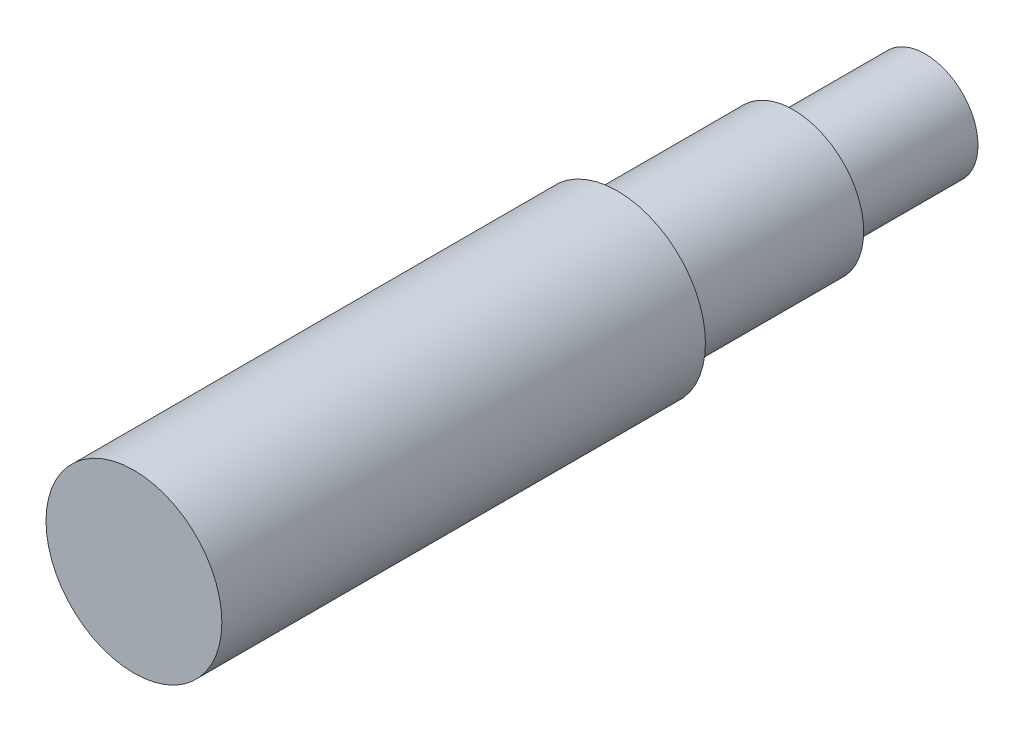
ISO-10303-21;
HEADER;
FILE_DESCRIPTION(('STEP AP214'),'2;1');
FILE_NAME('part.step','',(''),(''),'','','');
FILE_SCHEMA(('AUTOMOTIVE_DESIGN { 1 0 10303 214 1 1 1 1 }'));
ENDSEC;
DATA;
#1=APPLICATION_CONTEXT('core data for automotive mechanical design processes');
#2=APPLICATION_PROTOCOL_DEFINITION('international standard','automotive_design',2000,#1);
#3=PRODUCT_CONTEXT('',#1,'mechanical');
#4=PRODUCT('Part','Part','',(#3));
#5=PRODUCT_RELATED_PRODUCT_CATEGORY('part','',(#4));
#6=PRODUCT_DEFINITION_FORMATION('','',#4);
#7=PRODUCT_DEFINITION_CONTEXT('part definition',#1,'design');
#8=PRODUCT_DEFINITION('design','',#6,#7);
#9=PRODUCT_DEFINITION_SHAPE('','',#8);
#10=(LENGTH_UNIT() NAMED_UNIT(*) SI_UNIT(.MILLI.,.METRE.));
#11=(NAMED_UNIT(*) PLANE_ANGLE_UNIT() SI_UNIT($,.RADIAN.));
#12=(NAMED_UNIT(*) SI_UNIT($,.STERADIAN.) SOLID_ANGLE_UNIT());
#13=UNCERTAINTY_MEASURE_WITH_UNIT(LENGTH_MEASURE(1.E-05),#10,'distance_accuracy_value','');
#14=(GEOMETRIC_REPRESENTATION_CONTEXT(3) GLOBAL_UNCERTAINTY_ASSIGNED_CONTEXT((#13)) GLOBAL_UNIT_ASSIGNED_CONTEXT((#10,
#11,#12)) REPRESENTATION_CONTEXT('',''));
#15=CARTESIAN_POINT('',(0.,0.,0.));
#16=DIRECTION('',(0.,0.,1.));
#17=DIRECTION('',(1.,0.,0.));
#18=AXIS2_PLACEMENT_3D('',#15,#16,#17);
#19=CARTESIAN_POINT('',(0.,0.,0.));
#20=DIRECTION('',(0.,0.,-1.));
#21=DIRECTION('',(-1.,0.,0.));
#22=AXIS2_PLACEMENT_3D('',#19,#20,#21);
#23=PLANE('',#22);
#24=CARTESIAN_POINT('',(0.,0.,0.));
#25=DIRECTION('',(0.,0.,1.));
#26=DIRECTION('',(1.,0.,0.));
#27=AXIS2_PLACEMENT_3D('',#24,#25,#26);
#28=CIRCLE('',#27,20.);
#29=CARTESIAN_POINT('',(20.,0.,0.));
#30=VERTEX_POINT('',#29);
#31=EDGE_CURVE('E11',#30,#30,#28,.T.);
#32=ORIENTED_EDGE('',*,*,#31,.T.);
#33=EDGE_LOOP('',(#32));
#34=FACE_BOUND('',#33,.T.);
#35=ADVANCED_FACE('F40',(#34),#23,.F.);
#36=CARTESIAN_POINT('',(0.,0.,0.));
#37=DIRECTION('',(0.,0.,1.));
#38=DIRECTION('',(1.,0.,0.));
#39=AXIS2_PLACEMENT_3D('',#36,#37,#38);
#40=CYLINDRICAL_SURFACE('',#39,20.);
#41=ORIENTED_EDGE('',*,*,#31,.F.);
#42=EDGE_LOOP('',(#41));
#43=FACE_BOUND('',#42,.T.);
#44=CARTESIAN_POINT('',(0.,0.,-110.));
#45=DIRECTION('',(0.,0.,1.));
#46=DIRECTION('',(1.,0.,0.));
#47=AXIS2_PLACEMENT_3D('',#44,#45,#46);
#48=CIRCLE('',#47,20.);
#49=CARTESIAN_POINT('',(20.,0.,-110.));
#50=VERTEX_POINT('',#49);
#51=EDGE_CURVE('E48',#50,#50,#48,.T.);
#52=ORIENTED_EDGE('',*,*,#51,.T.);
#53=EDGE_LOOP('',(#52));
#54=FACE_BOUND('',#53,.T.);
#55=ADVANCED_FACE('F93',(#43,#54),#40,.T.);
#56=CARTESIAN_POINT('',(0.,20.,-110.));
#57=DIRECTION('',(0.,0.,1.));
#58=DIRECTION('',(1.,0.,0.));
#59=AXIS2_PLACEMENT_3D('',#56,#57,#58);
#60=PLANE('',#59);
#61=ORIENTED_EDGE('',*,*,#51,.F.);
#62=EDGE_LOOP('',(#61));
#63=FACE_BOUND('',#62,.T.);
#64=CARTESIAN_POINT('',(0.,0.,-110.));
#65=DIRECTION('',(0.,0.,1.));
#66=DIRECTION('',(1.,0.,0.));
#67=AXIS2_PLACEMENT_3D('',#64,#65,#66);
#68=CIRCLE('',#67,16.);
#69=CARTESIAN_POINT('',(16.,0.,-110.));
#70=VERTEX_POINT('',#69);
#71=EDGE_CURVE('E53',#70,#70,#68,.T.);
#72=ORIENTED_EDGE('',*,*,#71,.T.);
#73=EDGE_LOOP('',(#72));
#74=FACE_BOUND('',#73,.T.);
#75=ADVANCED_FACE('F97',(#63,#74),#60,.F.);
#76=CARTESIAN_POINT('',(0.,0.,0.));
#77=DIRECTION('',(0.,0.,1.));
#78=DIRECTION('',(1.,0.,0.));
#79=AXIS2_PLACEMENT_3D('',#76,#77,#78);
#80=CYLINDRICAL_SURFACE('',#79,16.);
#81=ORIENTED_EDGE('',*,*,#71,.F.);
#82=EDGE_LOOP('',(#81));
#83=FACE_BOUND('',#82,.T.);
#84=CARTESIAN_POINT('',(0.,0.,-150.));
#85=DIRECTION('',(0.,0.,1.));
#86=DIRECTION('',(1.,0.,0.));
#87=AXIS2_PLACEMENT_3D('',#84,#85,#86);
#88=CIRCLE('',#87,16.);
#89=CARTESIAN_POINT('',(16.,0.,-150.));
#90=VERTEX_POINT('',#89);
#91=EDGE_CURVE('E58',#90,#90,#88,.T.);
#92=ORIENTED_EDGE('',*,*,#91,.T.);
#93=EDGE_LOOP('',(#92));
#94=FACE_BOUND('',#93,.T.);
#95=ADVANCED_FACE('F102',(#83,#94),#80,.T.);
#96=CARTESIAN_POINT('',(0.,16.,-150.));
#97=DIRECTION('',(0.,0.,1.));
#98=DIRECTION('',(1.,0.,0.));
#99=AXIS2_PLACEMENT_3D('',#96,#97,#98);
#100=PLANE('',#99);
#101=ORIENTED_EDGE('',*,*,#91,.F.);
#102=EDGE_LOOP('',(#101));
#103=FACE_BOUND('',#102,.T.);
#104=CARTESIAN_POINT('',(0.,0.,-150.));
#105=DIRECTION('',(0.,0.,1.));
#106=DIRECTION('',(1.,0.,0.));
#107=AXIS2_PLACEMENT_3D('',#104,#105,#106);
#108=CIRCLE('',#107,12.);
#109=CARTESIAN_POINT('',(12.,0.,-150.));
#110=VERTEX_POINT('',#109);
#111=EDGE_CURVE('E71',#110,#110,#108,.T.);
#112=ORIENTED_EDGE('',*,*,#111,.T.);
#113=EDGE_LOOP('',(#112));
#114=FACE_BOUND('',#113,.T.);
#115=ADVANCED_FACE('F89',(#103,#114),#100,.F.);
#116=CARTESIAN_POINT('',(0.,0.,0.));
#117=DIRECTION('',(0.,0.,1.));
#118=DIRECTION('',(1.,0.,0.));
#119=AXIS2_PLACEMENT_3D('',#116,#117,#118);
#120=CYLINDRICAL_SURFACE('',#119,12.);
#121=ORIENTED_EDGE('',*,*,#111,.F.);
#122=EDGE_LOOP('',(#121));
#123=FACE_BOUND('',#122,.T.);
#124=CARTESIAN_POINT('',(0.,0.,-180.));
#125=DIRECTION('',(0.,0.,1.));
#126=DIRECTION('',(1.,0.,0.));
#127=AXIS2_PLACEMENT_3D('',#124,#125,#126);
#128=CIRCLE('',#127,12.);
#129=CARTESIAN_POINT('',(12.,0.,-180.));
#130=VERTEX_POINT('',#129);
#131=EDGE_CURVE('E75',#130,#130,#128,.T.);
#132=ORIENTED_EDGE('',*,*,#131,.T.);
#133=EDGE_LOOP('',(#132));
#134=FACE_BOUND('',#133,.T.);
#135=ADVANCED_FACE('F81',(#123,#134),#120,.T.);
#136=CARTESIAN_POINT('',(0.,12.,-180.));
#137=DIRECTION('',(0.,0.,1.));
#138=DIRECTION('',(1.,0.,0.));
#139=AXIS2_PLACEMENT_3D('',#136,#137,#138);
#140=PLANE('',#139);
#141=ORIENTED_EDGE('',*,*,#131,.F.);
#142=EDGE_LOOP('',(#141));
#143=FACE_BOUND('',#142,.T.);
#144=ADVANCED_FACE('F83',(#143),#140,.F.);
#145=CLOSED_SHELL('',(#35,#55,#75,#95,#115,#135,#144));
#146=MANIFOLD_SOLID_BREP('B2',#145);
#147=ADVANCED_BREP_SHAPE_REPRESENTATION('',(#18,#146),#14);
#148=SHAPE_DEFINITION_REPRESENTATION(#9,#147);
ENDSEC;
END-ISO-10303-21;
